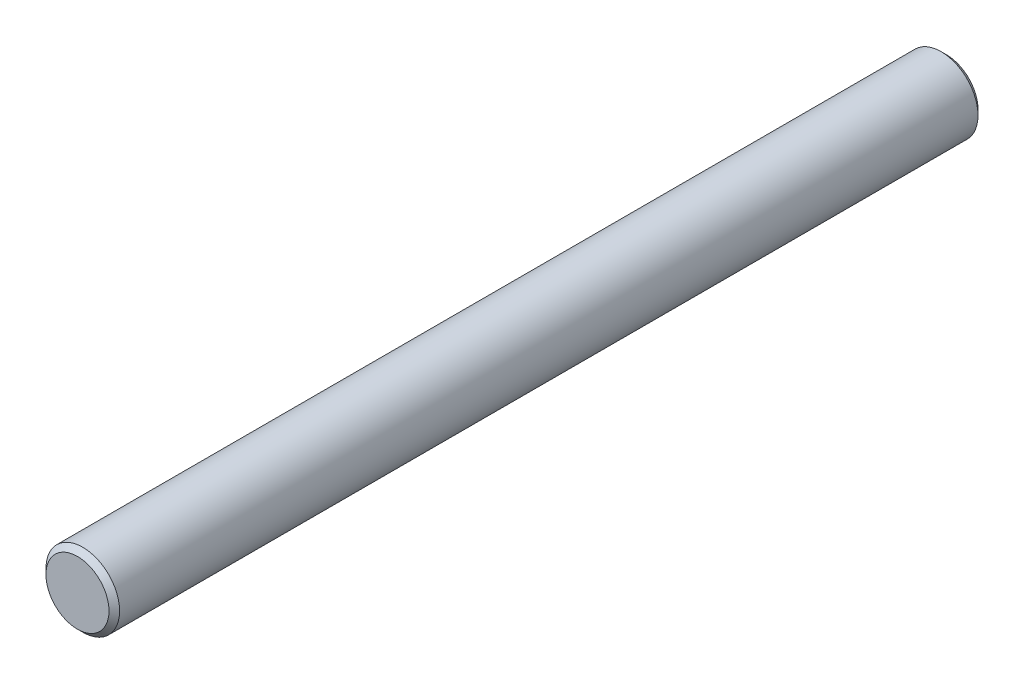
ISO-10303-21;
HEADER;
FILE_DESCRIPTION(('STEP AP214'),'2;1');
FILE_NAME('part.step','',(''),(''),'','','');
FILE_SCHEMA(('AUTOMOTIVE_DESIGN { 1 0 10303 214 1 1 1 1 }'));
ENDSEC;
DATA;
#1=APPLICATION_CONTEXT('core data for automotive mechanical design processes');
#2=APPLICATION_PROTOCOL_DEFINITION('international standard','automotive_design',2000,#1);
#3=PRODUCT_CONTEXT('',#1,'mechanical');
#4=PRODUCT('Part','Part','',(#3));
#5=PRODUCT_RELATED_PRODUCT_CATEGORY('part','',(#4));
#6=PRODUCT_DEFINITION_FORMATION('','',#4);
#7=PRODUCT_DEFINITION_CONTEXT('part definition',#1,'design');
#8=PRODUCT_DEFINITION('design','',#6,#7);
#9=PRODUCT_DEFINITION_SHAPE('','',#8);
#10=(LENGTH_UNIT() NAMED_UNIT(*) SI_UNIT(.MILLI.,.METRE.));
#11=(NAMED_UNIT(*) PLANE_ANGLE_UNIT() SI_UNIT($,.RADIAN.));
#12=(NAMED_UNIT(*) SI_UNIT($,.STERADIAN.) SOLID_ANGLE_UNIT());
#13=UNCERTAINTY_MEASURE_WITH_UNIT(LENGTH_MEASURE(1.E-05),#10,'distance_accuracy_value','');
#14=(GEOMETRIC_REPRESENTATION_CONTEXT(3) GLOBAL_UNCERTAINTY_ASSIGNED_CONTEXT((#13)) GLOBAL_UNIT_ASSIGNED_CONTEXT((#10,
#11,#12)) REPRESENTATION_CONTEXT('',''));
#15=CARTESIAN_POINT('',(0.,0.,0.));
#16=DIRECTION('',(0.,0.,1.));
#17=DIRECTION('',(1.,0.,0.));
#18=AXIS2_PLACEMENT_3D('',#15,#16,#17);
#19=CARTESIAN_POINT('',(0.,0.,41.));
#20=DIRECTION('',(0.,0.,-1.));
#21=DIRECTION('',(-1.,0.,0.));
#22=AXIS2_PLACEMENT_3D('',#19,#20,#21);
#23=CYLINDRICAL_SURFACE('',#22,3.475);
#24=CARTESIAN_POINT('',(0.,0.,-40.5));
#25=DIRECTION('',(0.,0.,1.));
#26=DIRECTION('',(1.,0.,0.));
#27=AXIS2_PLACEMENT_3D('',#24,#25,#26);
#28=CIRCLE('',#27,3.475);
#29=CARTESIAN_POINT('',(3.475,0.,-40.5));
#30=VERTEX_POINT('',#29);
#31=EDGE_CURVE('E53',#30,#30,#28,.T.);
#32=ORIENTED_EDGE('',*,*,#31,.T.);
#33=EDGE_LOOP('',(#32));
#34=FACE_BOUND('',#33,.T.);
#35=CARTESIAN_POINT('',(0.,0.,40.5));
#36=DIRECTION('',(0.,0.,1.));
#37=DIRECTION('',(1.,0.,0.));
#38=AXIS2_PLACEMENT_3D('',#35,#36,#37);
#39=CIRCLE('',#38,3.475);
#40=CARTESIAN_POINT('',(3.475,0.,40.5));
#41=VERTEX_POINT('',#40);
#42=EDGE_CURVE('E58',#41,#41,#39,.F.);
#43=ORIENTED_EDGE('',*,*,#42,.T.);
#44=EDGE_LOOP('',(#43));
#45=FACE_BOUND('',#44,.T.);
#46=ADVANCED_FACE('F39',(#34,#45),#23,.T.);
#47=CARTESIAN_POINT('',(0.,0.,41.));
#48=DIRECTION('',(0.,0.,1.));
#49=DIRECTION('',(1.,0.,0.));
#50=AXIS2_PLACEMENT_3D('',#47,#48,#49);
#51=PLANE('',#50);
#52=CARTESIAN_POINT('',(0.,0.,41.));
#53=DIRECTION('',(0.,0.,1.));
#54=DIRECTION('',(1.,0.,0.));
#55=AXIS2_PLACEMENT_3D('',#52,#53,#54);
#56=CIRCLE('',#55,2.97500000000001);
#57=CARTESIAN_POINT('',(2.97500000000001,0.,41.));
#58=VERTEX_POINT('',#57);
#59=EDGE_CURVE('E10',#58,#58,#56,.T.);
#60=ORIENTED_EDGE('',*,*,#59,.T.);
#61=EDGE_LOOP('',(#60));
#62=FACE_BOUND('',#61,.T.);
#63=ADVANCED_FACE('F75',(#62),#51,.T.);
#64=CARTESIAN_POINT('',(0.,0.,-41.));
#65=DIRECTION('',(0.,0.,1.));
#66=DIRECTION('',(1.,0.,0.));
#67=AXIS2_PLACEMENT_3D('',#64,#65,#66);
#68=PLANE('',#67);
#69=CARTESIAN_POINT('',(0.,0.,-41.));
#70=DIRECTION('',(0.,0.,1.));
#71=DIRECTION('',(1.,0.,0.));
#72=AXIS2_PLACEMENT_3D('',#69,#70,#71);
#73=CIRCLE('',#72,2.97499999999999);
#74=CARTESIAN_POINT('',(2.97499999999999,0.,-41.));
#75=VERTEX_POINT('',#74);
#76=EDGE_CURVE('E48',#75,#75,#73,.F.);
#77=ORIENTED_EDGE('',*,*,#76,.T.);
#78=EDGE_LOOP('',(#77));
#79=FACE_BOUND('',#78,.T.);
#80=ADVANCED_FACE('F72',(#79),#68,.F.);
#81=CARTESIAN_POINT('',(0.,0.,-40.5));
#82=DIRECTION('',(0.,0.,1.));
#83=DIRECTION('',(1.,0.,0.));
#84=AXIS2_PLACEMENT_3D('',#81,#82,#83);
#85=CONICAL_SURFACE('',#84,3.475,0.785398163397443);
#86=ORIENTED_EDGE('',*,*,#76,.F.);
#87=EDGE_LOOP('',(#86));
#88=FACE_BOUND('',#87,.T.);
#89=ORIENTED_EDGE('',*,*,#31,.F.);
#90=EDGE_LOOP('',(#89));
#91=FACE_BOUND('',#90,.T.);
#92=ADVANCED_FACE('F68',(#88,#91),#85,.T.);
#93=CARTESIAN_POINT('',(0.,0.,41.));
#94=DIRECTION('',(0.,0.,-1.));
#95=DIRECTION('',(-1.,0.,0.));
#96=AXIS2_PLACEMENT_3D('',#93,#94,#95);
#97=CONICAL_SURFACE('',#96,2.97500000000001,0.78539816339745);
#98=ORIENTED_EDGE('',*,*,#42,.F.);
#99=EDGE_LOOP('',(#98));
#100=FACE_BOUND('',#99,.T.);
#101=ORIENTED_EDGE('',*,*,#59,.F.);
#102=EDGE_LOOP('',(#101));
#103=FACE_BOUND('',#102,.T.);
#104=ADVANCED_FACE('F42',(#100,#103),#97,.T.);
#105=CLOSED_SHELL('',(#46,#63,#80,#92,#104));
#106=MANIFOLD_SOLID_BREP('B2',#105);
#107=ADVANCED_BREP_SHAPE_REPRESENTATION('',(#18,#106),#14);
#108=SHAPE_DEFINITION_REPRESENTATION(#9,#107);
ENDSEC;
END-ISO-10303-21;
